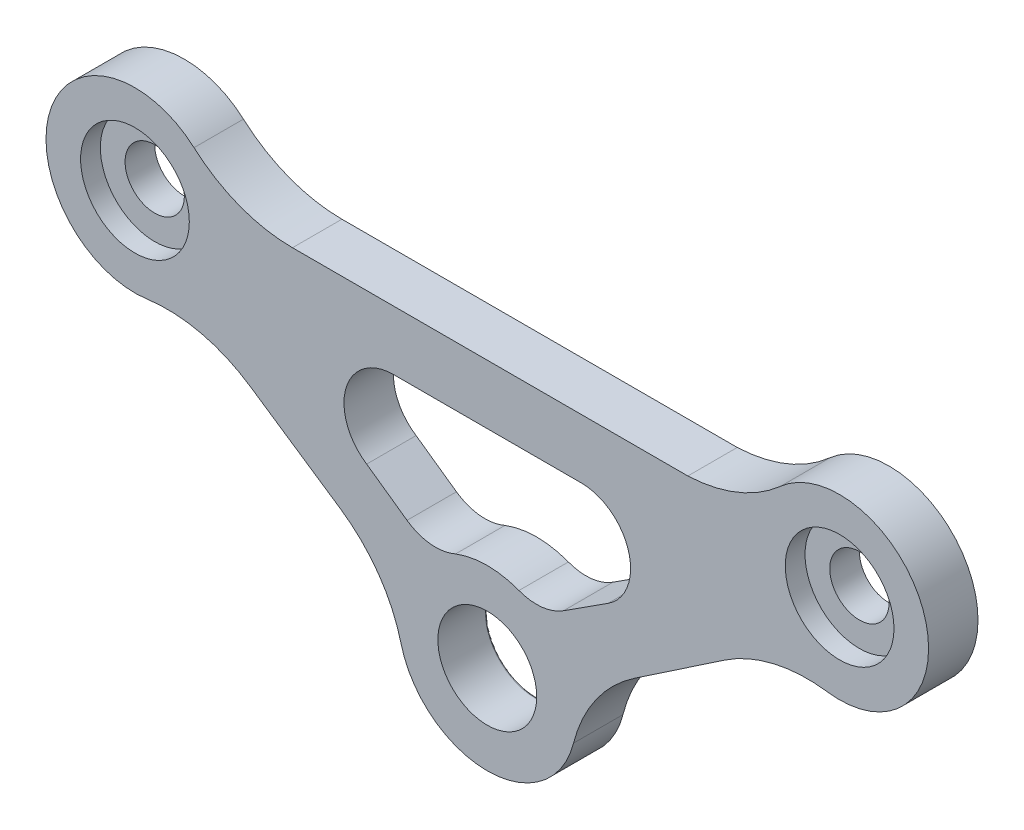
ISO-10303-21;
HEADER;
FILE_DESCRIPTION(('STEP AP214'),'2;1');
FILE_NAME('part.step','',(''),(''),'','','');
FILE_SCHEMA(('AUTOMOTIVE_DESIGN { 1 0 10303 214 1 1 1 1 }'));
ENDSEC;
DATA;
#1=APPLICATION_CONTEXT('core data for automotive mechanical design processes');
#2=APPLICATION_PROTOCOL_DEFINITION('international standard','automotive_design',2000,#1);
#3=PRODUCT_CONTEXT('',#1,'mechanical');
#4=PRODUCT('Part','Part','',(#3));
#5=PRODUCT_RELATED_PRODUCT_CATEGORY('part','',(#4));
#6=PRODUCT_DEFINITION_FORMATION('','',#4);
#7=PRODUCT_DEFINITION_CONTEXT('part definition',#1,'design');
#8=PRODUCT_DEFINITION('design','',#6,#7);
#9=PRODUCT_DEFINITION_SHAPE('','',#8);
#10=(LENGTH_UNIT() NAMED_UNIT(*) SI_UNIT(.MILLI.,.METRE.));
#11=(NAMED_UNIT(*) PLANE_ANGLE_UNIT() SI_UNIT($,.RADIAN.));
#12=(NAMED_UNIT(*) SI_UNIT($,.STERADIAN.) SOLID_ANGLE_UNIT());
#13=UNCERTAINTY_MEASURE_WITH_UNIT(LENGTH_MEASURE(1.E-05),#10,'distance_accuracy_value','');
#14=(GEOMETRIC_REPRESENTATION_CONTEXT(3) GLOBAL_UNCERTAINTY_ASSIGNED_CONTEXT((#13)) GLOBAL_UNIT_ASSIGNED_CONTEXT((#10,
#11,#12)) REPRESENTATION_CONTEXT('',''));
#15=CARTESIAN_POINT('',(0.,0.,0.));
#16=DIRECTION('',(0.,0.,1.));
#17=DIRECTION('',(1.,0.,0.));
#18=AXIS2_PLACEMENT_3D('',#15,#16,#17);
#19=CARTESIAN_POINT('',(35.64893240205,24.04550222281,1.5));
#20=DIRECTION('',(0.,0.,1.));
#21=DIRECTION('',(1.,0.,0.));
#22=AXIS2_PLACEMENT_3D('',#19,#20,#21);
#23=CYLINDRICAL_SURFACE('',#22,5.5);
#24=CARTESIAN_POINT('',(35.64893240205,24.04550222281,2.5));
#25=DIRECTION('',(0.,0.,1.));
#26=DIRECTION('',(1.,0.,0.));
#27=AXIS2_PLACEMENT_3D('',#24,#25,#26);
#28=CIRCLE('',#27,5.5);
#29=CARTESIAN_POINT('',(41.14893240205,24.04550222281,2.5));
#30=VERTEX_POINT('',#29);
#31=EDGE_CURVE('E229',#30,#30,#28,.F.);
#32=ORIENTED_EDGE('',*,*,#31,.F.);
#33=EDGE_LOOP('',(#32));
#34=FACE_BOUND('',#33,.T.);
#35=CARTESIAN_POINT('',(35.64893240205,24.04550222281,0.5));
#36=DIRECTION('',(0.,0.,1.));
#37=DIRECTION('',(1.,0.,0.));
#38=AXIS2_PLACEMENT_3D('',#35,#36,#37);
#39=CIRCLE('',#38,5.5);
#40=CARTESIAN_POINT('',(41.14893240205,24.04550222281,0.5));
#41=VERTEX_POINT('',#40);
#42=EDGE_CURVE('E241',#41,#41,#39,.T.);
#43=ORIENTED_EDGE('',*,*,#42,.F.);
#44=EDGE_LOOP('',(#43));
#45=FACE_BOUND('',#44,.T.);
#46=ADVANCED_FACE('F16',(#34,#45),#23,.F.);
#47=CARTESIAN_POINT('',(-35.64892089109,24.04550222281,1.5));
#48=DIRECTION('',(0.,0.,1.));
#49=DIRECTION('',(1.,0.,0.));
#50=AXIS2_PLACEMENT_3D('',#47,#48,#49);
#51=CYLINDRICAL_SURFACE('',#50,5.5);
#52=CARTESIAN_POINT('',(-35.64892089109,24.04550222281,2.5));
#53=DIRECTION('',(0.,0.,1.));
#54=DIRECTION('',(1.,0.,0.));
#55=AXIS2_PLACEMENT_3D('',#52,#53,#54);
#56=CIRCLE('',#55,5.5);
#57=CARTESIAN_POINT('',(-30.14892089109,24.04550222281,2.5));
#58=VERTEX_POINT('',#57);
#59=EDGE_CURVE('E169',#58,#58,#56,.F.);
#60=ORIENTED_EDGE('',*,*,#59,.F.);
#61=EDGE_LOOP('',(#60));
#62=FACE_BOUND('',#61,.T.);
#63=CARTESIAN_POINT('',(-35.64892089109,24.04550222281,0.5));
#64=DIRECTION('',(0.,0.,1.));
#65=DIRECTION('',(1.,0.,0.));
#66=AXIS2_PLACEMENT_3D('',#63,#64,#65);
#67=CIRCLE('',#66,5.5);
#68=CARTESIAN_POINT('',(-30.14892089109,24.04550222281,0.5));
#69=VERTEX_POINT('',#68);
#70=EDGE_CURVE('E237',#69,#69,#67,.T.);
#71=ORIENTED_EDGE('',*,*,#70,.F.);
#72=EDGE_LOOP('',(#71));
#73=FACE_BOUND('',#72,.T.);
#74=ADVANCED_FACE('F686',(#62,#73),#51,.F.);
#75=CARTESIAN_POINT('',(0.,0.,0.1));
#76=DIRECTION('',(0.,0.,1.));
#77=DIRECTION('',(1.,0.,0.));
#78=AXIS2_PLACEMENT_3D('',#75,#76,#77);
#79=CYLINDRICAL_SURFACE('',#78,5.);
#80=CARTESIAN_POINT('',(0.,0.,2.5));
#81=DIRECTION('',(0.,0.,1.));
#82=DIRECTION('',(1.,0.,0.));
#83=AXIS2_PLACEMENT_3D('',#80,#81,#82);
#84=CIRCLE('',#83,5.);
#85=CARTESIAN_POINT('',(5.,0.,2.5));
#86=VERTEX_POINT('',#85);
#87=EDGE_CURVE('E233',#86,#86,#84,.F.);
#88=ORIENTED_EDGE('',*,*,#87,.F.);
#89=EDGE_LOOP('',(#88));
#90=FACE_BOUND('',#89,.T.);
#91=CARTESIAN_POINT('',(0.,0.,-2.3));
#92=DIRECTION('',(0.,0.,1.));
#93=DIRECTION('',(0.,-1.,0.));
#94=AXIS2_PLACEMENT_3D('',#91,#92,#93);
#95=CIRCLE('',#94,5.);
#96=CARTESIAN_POINT('',(0.,-5.,-2.3));
#97=VERTEX_POINT('',#96);
#98=EDGE_CURVE('E189',#97,#97,#95,.T.);
#99=ORIENTED_EDGE('',*,*,#98,.F.);
#100=EDGE_LOOP('',(#99));
#101=FACE_BOUND('',#100,.T.);
#102=ADVANCED_FACE('F679',(#90,#101),#79,.F.);
#103=CARTESIAN_POINT('',(28.93034266074,17.3269124815,0.5));
#104=DIRECTION('',(0.,0.,1.));
#105=DIRECTION('',(1.,0.,0.));
#106=AXIS2_PLACEMENT_3D('',#103,#104,#105);
#107=PLANE('',#106);
#108=CARTESIAN_POINT('',(35.64893240205,24.04550222281,0.5));
#109=DIRECTION('',(0.,0.,1.));
#110=DIRECTION('',(1.,0.,0.));
#111=AXIS2_PLACEMENT_3D('',#108,#109,#110);
#112=CIRCLE('',#111,3.);
#113=CARTESIAN_POINT('',(38.64893240205,24.04550222281,0.5));
#114=VERTEX_POINT('',#113);
#115=EDGE_CURVE('E193',#114,#114,#112,.F.);
#116=ORIENTED_EDGE('',*,*,#115,.T.);
#117=EDGE_LOOP('',(#116));
#118=FACE_BOUND('',#117,.T.);
#119=ORIENTED_EDGE('',*,*,#42,.T.);
#120=EDGE_LOOP('',(#119));
#121=FACE_BOUND('',#120,.T.);
#122=ADVANCED_FACE('F515',(#118,#121),#107,.T.);
#123=CARTESIAN_POINT('',(-42.3675106324,17.3269124815,0.5));
#124=DIRECTION('',(0.,0.,1.));
#125=DIRECTION('',(1.,0.,0.));
#126=AXIS2_PLACEMENT_3D('',#123,#124,#125);
#127=PLANE('',#126);
#128=CARTESIAN_POINT('',(-35.64892089109,24.04550222281,0.5));
#129=DIRECTION('',(0.,0.,1.));
#130=DIRECTION('',(1.,0.,0.));
#131=AXIS2_PLACEMENT_3D('',#128,#129,#130);
#132=CIRCLE('',#131,3.);
#133=CARTESIAN_POINT('',(-32.64892089109,24.04550222281,0.5));
#134=VERTEX_POINT('',#133);
#135=EDGE_CURVE('E409',#134,#134,#132,.F.);
#136=ORIENTED_EDGE('',*,*,#135,.T.);
#137=EDGE_LOOP('',(#136));
#138=FACE_BOUND('',#137,.T.);
#139=ORIENTED_EDGE('',*,*,#70,.T.);
#140=EDGE_LOOP('',(#139));
#141=FACE_BOUND('',#140,.T.);
#142=ADVANCED_FACE('F666',(#138,#141),#127,.T.);
#143=CARTESIAN_POINT('',(-53.80166707867,-13.48273707526,2.5));
#144=DIRECTION('',(0.,0.,1.));
#145=DIRECTION('',(1.,0.,0.));
#146=AXIS2_PLACEMENT_3D('',#143,#144,#145);
#147=PLANE('',#146);
#148=CARTESIAN_POINT('',(-5.235668754389,12.9790059498,2.5));
#149=DIRECTION('',(0.,0.,-1.));
#150=DIRECTION('',(-1.,0.,0.));
#151=AXIS2_PLACEMENT_3D('',#148,#149,#150);
#152=CIRCLE('',#151,4.999999999993);
#153=CARTESIAN_POINT('',(-3.20413659858878,8.41032155493498,2.5));
#154=VERTEX_POINT('',#153);
#155=CARTESIAN_POINT('',(-8.12159551358728,8.89594009918456,2.5));
#156=VERTEX_POINT('',#155);
#157=EDGE_CURVE('E326',#154,#156,#152,.T.);
#158=ORIENTED_EDGE('',*,*,#157,.T.);
#159=DIRECTION('',(-0.816613006149319,0.577185583835713,0.));
#160=VECTOR('',#159,1.);
#161=CARTESIAN_POINT('',(-7.578312031756,8.511944998338,2.5));
#162=LINE('',#161,#160);
#163=CARTESIAN_POINT('',(-12.2046620185913,11.7818690403664,2.5));
#164=VERTEX_POINT('',#163);
#165=EDGE_CURVE('E405',#164,#156,#162,.F.);
#166=ORIENTED_EDGE('',*,*,#165,.F.);
#167=CARTESIAN_POINT('',(-9.499997749285,15.98719794432,2.5));
#168=DIRECTION('',(0.,0.,-1.));
#169=DIRECTION('',(-1.,0.,0.));
#170=AXIS2_PLACEMENT_3D('',#167,#168,#169);
#171=CIRCLE('',#170,5.000000000009);
#172=CARTESIAN_POINT('',(-9.49999775994559,20.9871979443295,2.5));
#173=VERTEX_POINT('',#172);
#174=EDGE_CURVE('E493',#164,#173,#171,.T.);
#175=ORIENTED_EDGE('',*,*,#174,.T.);
#176=DIRECTION('',(1.,0.,0.));
#177=VECTOR('',#176,1.);
#178=CARTESIAN_POINT('',(-11.5185874906,20.98719794433,2.5));
#179=LINE('',#178,#177);
#180=CARTESIAN_POINT('',(9.50000225785928,20.98719794433,2.5));
#181=VERTEX_POINT('',#180);
#182=EDGE_CURVE('E410',#181,#173,#179,.F.);
#183=ORIENTED_EDGE('',*,*,#182,.F.);
#184=CARTESIAN_POINT('',(9.500002250715,15.98719794429,2.5));
#185=DIRECTION('',(0.,0.,-1.));
#186=DIRECTION('',(-1.,0.,0.));
#187=AXIS2_PLACEMENT_3D('',#184,#185,#186);
#188=CIRCLE('',#187,5.000000000039);
#189=CARTESIAN_POINT('',(12.2046662838837,11.7818688884277,2.5));
#190=VERTEX_POINT('',#189);
#191=EDGE_CURVE('E418',#181,#190,#188,.T.);
#192=ORIENTED_EDGE('',*,*,#191,.T.);
#193=DIRECTION('',(-0.84106582120401,-0.540932791021606,0.));
#194=VECTOR('',#193,1.);
#195=CARTESIAN_POINT('',(12.79122582465,12.15911556935,2.5));
#196=LINE('',#195,#194);
#197=CARTESIAN_POINT('',(7.71750000606634,8.89594091793455,2.5));
#198=VERTEX_POINT('',#197);
#199=EDGE_CURVE('E414',#198,#190,#196,.F.);
#200=ORIENTED_EDGE('',*,*,#199,.F.);
#201=CARTESIAN_POINT('',(4.984212486652,13.0827224188,2.5));
#202=DIRECTION('',(0.,0.,-1.));
#203=DIRECTION('',(-1.,0.,0.));
#204=AXIS2_PLACEMENT_3D('',#201,#202,#203);
#205=CIRCLE('',#204,4.999999999995);
#206=CARTESIAN_POINT('',(3.20414677618147,8.41031767750996,2.5));
#207=VERTEX_POINT('',#206);
#208=EDGE_CURVE('E311',#198,#207,#205,.T.);
#209=ORIENTED_EDGE('',*,*,#208,.T.);
#210=CARTESIAN_POINT('',(0.,0.,2.5));
#211=DIRECTION('',(0.,0.,-1.));
#212=DIRECTION('',(-1.,0.,0.));
#213=AXIS2_PLACEMENT_3D('',#210,#211,#212);
#214=CIRCLE('',#213,8.99999999999);
#215=EDGE_CURVE('E322',#154,#207,#214,.T.);
#216=ORIENTED_EDGE('',*,*,#215,.F.);
#217=EDGE_LOOP('',(#158,#166,#175,#183,#192,#200,#209,#216));
#218=FACE_BOUND('',#217,.T.);
#219=ORIENTED_EDGE('',*,*,#59,.T.);
#220=EDGE_LOOP('',(#219));
#221=FACE_BOUND('',#220,.T.);
#222=ORIENTED_EDGE('',*,*,#31,.T.);
#223=EDGE_LOOP('',(#222));
#224=FACE_BOUND('',#223,.T.);
#225=ORIENTED_EDGE('',*,*,#87,.T.);
#226=EDGE_LOOP('',(#225));
#227=FACE_BOUND('',#226,.T.);
#228=CARTESIAN_POINT('',(-19.70854590692,41.98719794437,2.5));
#229=DIRECTION('',(0.,0.,-1.));
#230=DIRECTION('',(-1.,0.,0.));
#231=AXIS2_PLACEMENT_3D('',#228,#229,#230);
#232=CIRCLE('',#231,15.00000000001);
#233=CARTESIAN_POINT('',(-19.7085486342382,26.98719794436,2.5));
#234=VERTEX_POINT('',#233);
#235=CARTESIAN_POINT('',(-29.6712824229047,30.7736400293567,2.5));
#236=VERTEX_POINT('',#235);
#237=EDGE_CURVE('E165',#234,#236,#232,.T.);
#238=ORIENTED_EDGE('',*,*,#237,.T.);
#239=CARTESIAN_POINT('',(-35.64892089109,24.04550222281,2.5));
#240=DIRECTION('',(0.,0.,-1.));
#241=DIRECTION('',(-1.,0.,0.));
#242=AXIS2_PLACEMENT_3D('',#239,#240,#241);
#243=CIRCLE('',#242,9.000000000014);
#244=CARTESIAN_POINT('',(-34.4257834115742,15.1290043280954,2.5));
#245=VERTEX_POINT('',#244);
#246=EDGE_CURVE('E157',#245,#236,#243,.T.);
#247=ORIENTED_EDGE('',*,*,#246,.F.);
#248=CARTESIAN_POINT('',(-32.3872209457,0.2681745036064,2.5));
#249=DIRECTION('',(0.,0.,-1.));
#250=DIRECTION('',(-1.,0.,0.));
#251=AXIS2_PLACEMENT_3D('',#248,#249,#250);
#252=CIRCLE('',#251,14.99999999999);
#253=CARTESIAN_POINT('',(-23.9993316949897,12.7037409932183,2.5));
#254=VERTEX_POINT('',#253);
#255=EDGE_CURVE('E162',#245,#254,#252,.T.);
#256=ORIENTED_EDGE('',*,*,#255,.T.);
#257=DIRECTION('',(0.829037598608781,-0.559192864844487,0.));
#258=VECTOR('',#257,1.);
#259=CARTESIAN_POINT('',(-13.83149060533,5.845446269613,2.5));
#260=LINE('',#259,#258);
#261=CARTESIAN_POINT('',(-14.879917539189,6.55261909471597,2.5));
#262=VERTEX_POINT('',#261);
#263=EDGE_CURVE('E180',#262,#254,#260,.F.);
#264=ORIENTED_EDGE('',*,*,#263,.F.);
#265=CARTESIAN_POINT('',(-23.26780930641,-5.882945697494,2.5));
#266=DIRECTION('',(0.,0.,-1.));
#267=DIRECTION('',(-1.,0.,0.));
#268=AXIS2_PLACEMENT_3D('',#265,#266,#267);
#269=CIRCLE('',#268,14.99999999999);
#270=CARTESIAN_POINT('',(-8.72542895208777,-2.20610280855798,2.5));
#271=VERTEX_POINT('',#270);
#272=EDGE_CURVE('E195',#262,#271,#269,.T.);
#273=ORIENTED_EDGE('',*,*,#272,.T.);
#274=CARTESIAN_POINT('',(0.,0.,2.5));
#275=DIRECTION('',(0.,0.,-1.));
#276=DIRECTION('',(-1.,0.,0.));
#277=AXIS2_PLACEMENT_3D('',#274,#275,#276);
#278=CIRCLE('',#277,8.99999999999);
#279=CARTESIAN_POINT('',(8.7254284899058,-2.20610463654231,2.5));
#280=VERTEX_POINT('',#279);
#281=EDGE_CURVE('E199',#280,#271,#278,.T.);
#282=ORIENTED_EDGE('',*,*,#281,.F.);
#283=CARTESIAN_POINT('',(23.26780930641,-5.882945697493,2.5));
#284=DIRECTION('',(0.,0.,-1.));
#285=DIRECTION('',(-1.,0.,0.));
#286=AXIS2_PLACEMENT_3D('',#283,#284,#285);
#287=CIRCLE('',#286,14.99999999999);
#288=CARTESIAN_POINT('',(14.8799187446377,6.55261990779489,2.5));
#289=VERTEX_POINT('',#288);
#290=EDGE_CURVE('E204',#280,#289,#287,.T.);
#291=ORIENTED_EDGE('',*,*,#290,.T.);
#292=DIRECTION('',(0.829037598608781,0.559192864844487,0.));
#293=VECTOR('',#292,1.);
#294=CARTESIAN_POINT('',(25.04775564686,13.41091180694,2.5));
#295=LINE('',#294,#293);
#296=CARTESIAN_POINT('',(23.9993299184323,12.7037397949107,2.5));
#297=VERTEX_POINT('',#296);
#298=EDGE_CURVE('E208',#297,#289,#295,.F.);
#299=ORIENTED_EDGE('',*,*,#298,.F.);
#300=CARTESIAN_POINT('',(32.38722289111,0.2681758157956,2.5));
#301=DIRECTION('',(0.,0.,-1.));
#302=DIRECTION('',(-1.,0.,0.));
#303=AXIS2_PLACEMENT_3D('',#300,#301,#302);
#304=CIRCLE('',#303,14.99999999999);
#305=CARTESIAN_POINT('',(34.4257471339366,15.1290108836449,2.5));
#306=VERTEX_POINT('',#305);
#307=EDGE_CURVE('E209',#297,#306,#304,.T.);
#308=ORIENTED_EDGE('',*,*,#307,.T.);
#309=CARTESIAN_POINT('',(35.64893240205,24.04550222281,2.5));
#310=DIRECTION('',(0.,0.,-1.));
#311=DIRECTION('',(-1.,0.,0.));
#312=AXIS2_PLACEMENT_3D('',#309,#310,#311);
#313=CIRCLE('',#312,8.999999999995);
#314=CARTESIAN_POINT('',(29.6663114142714,30.7692099883951,2.5));
#315=VERTEX_POINT('',#314);
#316=EDGE_CURVE('E213',#315,#306,#313,.T.);
#317=ORIENTED_EDGE('',*,*,#316,.F.);
#318=CARTESIAN_POINT('',(19.69522475353,41.97534361275,2.5));
#319=DIRECTION('',(0.,0.,-1.));
#320=DIRECTION('',(-1.,0.,0.));
#321=AXIS2_PLACEMENT_3D('',#318,#319,#320);
#322=CIRCLE('',#321,15.00000000007);
#323=CARTESIAN_POINT('',(20.2914901578057,26.9871986617122,2.5));
#324=VERTEX_POINT('',#323);
#325=EDGE_CURVE('E218',#315,#324,#322,.T.);
#326=ORIENTED_EDGE('',*,*,#325,.T.);
#327=DIRECTION('',(1.,0.,0.));
#328=VECTOR('',#327,1.);
#329=CARTESIAN_POINT('',(-23.82713564823,26.98719794436,2.5));
#330=LINE('',#329,#328);
#331=EDGE_CURVE('E222',#234,#324,#330,.T.);
#332=ORIENTED_EDGE('',*,*,#331,.F.);
#333=EDGE_LOOP('',(#238,#247,#256,#264,#273,#282,#291,#299,#308,#317,#326,#332));
#334=FACE_BOUND('',#333,.T.);
#335=ADVANCED_FACE('F159',(#218,#221,#224,#227,#334),#147,.T.);
#336=CARTESIAN_POINT('',(-35.64892089109,24.04550222281,0.));
#337=DIRECTION('',(0.,0.,-1.));
#338=DIRECTION('',(-1.,0.,0.));
#339=AXIS2_PLACEMENT_3D('',#336,#337,#338);
#340=CYLINDRICAL_SURFACE('',#339,9.000000000014);
#341=CARTESIAN_POINT('',(-35.64892089109,24.04550222281,-2.5));
#342=DIRECTION('',(0.,0.,-1.));
#343=DIRECTION('',(-1.,0.,0.));
#344=AXIS2_PLACEMENT_3D('',#341,#342,#343);
#345=CIRCLE('',#344,9.000000000014);
#346=CARTESIAN_POINT('',(-34.4257834115742,15.1290043280954,-2.5));
#347=VERTEX_POINT('',#346);
#348=CARTESIAN_POINT('',(-29.6712824229047,30.7736400293567,-2.5));
#349=VERTEX_POINT('',#348);
#350=EDGE_CURVE('E175',#347,#349,#345,.T.);
#351=ORIENTED_EDGE('',*,*,#350,.F.);
#352=DIRECTION('',(0.,0.,-1.));
#353=VECTOR('',#352,1.);
#354=CARTESIAN_POINT('',(-34.4257834115813,15.1290043280947,0.));
#355=LINE('',#354,#353);
#356=EDGE_CURVE('E172',#347,#245,#355,.F.);
#357=ORIENTED_EDGE('',*,*,#356,.T.);
#358=ORIENTED_EDGE('',*,*,#246,.T.);
#359=DIRECTION('',(0.,0.,-1.));
#360=VECTOR('',#359,1.);
#361=CARTESIAN_POINT('',(-29.6712845737851,30.7736419403162,0.));
#362=LINE('',#361,#360);
#363=EDGE_CURVE('E224',#236,#349,#362,.T.);
#364=ORIENTED_EDGE('',*,*,#363,.T.);
#365=EDGE_LOOP('',(#351,#357,#358,#364));
#366=FACE_BOUND('',#365,.T.);
#367=ADVANCED_FACE('F173',(#366),#340,.T.);
#368=CARTESIAN_POINT('',(-19.70854590692,41.98719794437,0.));
#369=DIRECTION('',(0.,0.,-1.));
#370=DIRECTION('',(-1.,0.,0.));
#371=AXIS2_PLACEMENT_3D('',#368,#369,#370);
#372=CYLINDRICAL_SURFACE('',#371,15.00000000001);
#373=ORIENTED_EDGE('',*,*,#237,.F.);
#374=DIRECTION('',(0.,0.,1.));
#375=VECTOR('',#374,1.);
#376=CARTESIAN_POINT('',(-19.7085513615564,26.98719794436,-3.118589741315));
#377=LINE('',#376,#375);
#378=CARTESIAN_POINT('',(-19.7085486342382,26.9871979443605,-2.5));
#379=VERTEX_POINT('',#378);
#380=EDGE_CURVE('E394',#379,#234,#377,.T.);
#381=ORIENTED_EDGE('',*,*,#380,.F.);
#382=CARTESIAN_POINT('',(-19.70854590692,41.98719794437,-2.5));
#383=DIRECTION('',(0.,0.,-1.));
#384=DIRECTION('',(-1.,0.,0.));
#385=AXIS2_PLACEMENT_3D('',#382,#383,#384);
#386=CIRCLE('',#385,15.00000000001);
#387=EDGE_CURVE('E487',#349,#379,#386,.F.);
#388=ORIENTED_EDGE('',*,*,#387,.F.);
#389=ORIENTED_EDGE('',*,*,#363,.F.);
#390=EDGE_LOOP('',(#373,#381,#388,#389));
#391=FACE_BOUND('',#390,.T.);
#392=ADVANCED_FACE('F648',(#391),#372,.F.);
#393=CARTESIAN_POINT('',(-23.82713564823,26.98719794436,-3.118589741315));
#394=DIRECTION('',(0.,1.,0.));
#395=DIRECTION('',(0.,0.,1.));
#396=AXIS2_PLACEMENT_3D('',#393,#394,#395);
#397=PLANE('',#396);
#398=CARTESIAN_POINT('',(20.2914901578057,26.9871993790644,2.5));
#399=CARTESIAN_POINT('',(20.2914896316677,26.9871993581333,2.29166666666667));
#400=CARTESIAN_POINT('',(20.2914891055298,26.9871993372023,2.08333333333333));
#401=CARTESIAN_POINT('',(20.2914880532539,26.9871992953402,1.66666666666667));
#402=CARTESIAN_POINT('',(20.291487527116,26.9871992744093,1.45833333333333));
#403=CARTESIAN_POINT('',(20.2914864748401,26.9871992325473,1.04166666666667));
#404=CARTESIAN_POINT('',(20.2914859487021,26.9871992116164,0.833333333333333));
#405=CARTESIAN_POINT('',(20.2914848964262,26.9871991697546,0.416666666666667));
#406=CARTESIAN_POINT('',(20.2914843702882,26.9871991488237,0.208333333333333));
#407=CARTESIAN_POINT('',(20.2914833180123,26.987199106962,-0.208333333333333));
#408=CARTESIAN_POINT('',(20.2914827918744,26.9871990860312,-0.416666666666667));
#409=CARTESIAN_POINT('',(20.2914817395985,26.9871990441696,-0.833333333333333));
#410=CARTESIAN_POINT('',(20.2914812134605,26.9871990232389,-1.04166666666667));
#411=CARTESIAN_POINT('',(20.2914801611846,26.9871989813774,-1.45833333333333));
#412=CARTESIAN_POINT('',(20.2914796350466,26.9871989604467,-1.66666666666667));
#413=CARTESIAN_POINT('',(20.2914785827707,26.9871989185853,-2.08333333333333));
#414=CARTESIAN_POINT('',(20.2914780566327,26.9871988976547,-2.29166666666667));
#415=CARTESIAN_POINT('',(20.2914775304947,26.9871988767241,-2.5));
#416=B_SPLINE_CURVE_WITH_KNOTS('',3,(#398,#399,#400,#401,#402,#403,#404,#405,#406,#407,#408,
#409,#410,#411,#412,#413,#414,#415),.UNSPECIFIED.,.F.,.F.,(4,2,2,2,2,2,2,2,4),(0.,
0.625000000001996,1.25000000000399,1.87500000000599,2.50000000000799,3.12500000000998,
3.75000000001198,4.37500000001397,5.00000000001597),.UNSPECIFIED.);
#417=CARTESIAN_POINT('',(20.2914775304947,26.9871988767241,-2.5));
#418=VERTEX_POINT('',#417);
#419=EDGE_CURVE('E221',#324,#418,#416,.T.);
#420=ORIENTED_EDGE('',*,*,#419,.T.);
#421=DIRECTION('',(-1.,0.,0.));
#422=VECTOR('',#421,1.);
#423=CARTESIAN_POINT('',(-53.80166707867,26.987197944361,-2.5));
#424=LINE('',#423,#422);
#425=EDGE_CURVE('E486',#379,#418,#424,.F.);
#426=ORIENTED_EDGE('',*,*,#425,.F.);
#427=ORIENTED_EDGE('',*,*,#380,.T.);
#428=ORIENTED_EDGE('',*,*,#331,.T.);
#429=EDGE_LOOP('',(#420,#426,#427,#428));
#430=FACE_BOUND('',#429,.T.);
#431=ADVANCED_FACE('F388',(#430),#397,.T.);
#432=CARTESIAN_POINT('',(19.69522475353,41.97534361275,0.));
#433=DIRECTION('',(0.,0.,-1.));
#434=DIRECTION('',(-1.,0.,0.));
#435=AXIS2_PLACEMENT_3D('',#432,#433,#434);
#436=CYLINDRICAL_SURFACE('',#435,15.00000000007);
#437=ORIENTED_EDGE('',*,*,#325,.F.);
#438=CARTESIAN_POINT('',(29.6662920339491,30.7691927440847,-2.5));
#439=CARTESIAN_POINT('',(29.6662928414622,30.769193462598,-2.29166666666667));
#440=CARTESIAN_POINT('',(29.6662936489755,30.7691941811111,-2.08333333333333));
#441=CARTESIAN_POINT('',(29.6662952640023,30.769195618137,-1.66666666666667));
#442=CARTESIAN_POINT('',(29.6662960715158,30.7691963366498,-1.45833333333333));
#443=CARTESIAN_POINT('',(29.6662976865432,30.7691977736751,-1.04166666666667));
#444=CARTESIAN_POINT('',(29.6662984940569,30.7691984921877,-0.833333333333333));
#445=CARTESIAN_POINT('',(29.6663001090848,30.7691999292124,-0.416666666666667));
#446=CARTESIAN_POINT('',(29.6663009165988,30.7692006477246,-0.208333333333333));
#447=CARTESIAN_POINT('',(29.6663025316272,30.7692020847488,0.208333333333333));
#448=CARTESIAN_POINT('',(29.6663033391415,30.7692028032608,0.416666666666667));
#449=CARTESIAN_POINT('',(29.6663049541704,30.7692042402844,0.833333333333333));
#450=CARTESIAN_POINT('',(29.666305761685,30.769204958796,1.04166666666667));
#451=CARTESIAN_POINT('',(29.6663073767144,30.769206395819,1.45833333333333));
#452=CARTESIAN_POINT('',(29.6663081842292,30.7692071143304,1.66666666666667));
#453=CARTESIAN_POINT('',(29.6663097992591,30.7692085513528,2.08333333333333));
#454=CARTESIAN_POINT('',(29.6663106067742,30.7692092698639,2.29166666666667));
#455=CARTESIAN_POINT('',(29.6663114142894,30.7692099883748,2.5));
#456=B_SPLINE_CURVE_WITH_KNOTS('',3,(#438,#439,#440,#441,#442,#443,#444,#445,#446,#447,#448,
#449,#450,#451,#452,#453,#454,#455),.UNSPECIFIED.,.F.,.F.,(4,2,2,2,2,2,2,2,4),(0.,
0.625000000008412,1.25000000001682,1.87500000002524,2.50000000003365,3.12500000004206,
3.75000000005047,4.37500000005888,5.0000000000673),.UNSPECIFIED.);
#457=CARTESIAN_POINT('',(29.6662920339111,30.7691927440509,-2.5));
#458=VERTEX_POINT('',#457);
#459=EDGE_CURVE('E217',#458,#315,#456,.T.);
#460=ORIENTED_EDGE('',*,*,#459,.F.);
#461=CARTESIAN_POINT('',(19.69522475353,41.97534361275,-2.5));
#462=DIRECTION('',(0.,0.,-1.));
#463=DIRECTION('',(-1.,0.,0.));
#464=AXIS2_PLACEMENT_3D('',#461,#462,#463);
#465=CIRCLE('',#464,15.00000000007);
#466=EDGE_CURVE('E482',#418,#458,#465,.F.);
#467=ORIENTED_EDGE('',*,*,#466,.F.);
#468=ORIENTED_EDGE('',*,*,#419,.F.);
#469=EDGE_LOOP('',(#437,#460,#467,#468));
#470=FACE_BOUND('',#469,.T.);
#471=ADVANCED_FACE('F383',(#470),#436,.F.);
#472=CARTESIAN_POINT('',(35.64893240205,24.04550222281,0.));
#473=DIRECTION('',(0.,0.,-1.));
#474=DIRECTION('',(-1.,0.,0.));
#475=AXIS2_PLACEMENT_3D('',#472,#473,#474);
#476=CYLINDRICAL_SURFACE('',#475,8.999999999995);
#477=ORIENTED_EDGE('',*,*,#316,.T.);
#478=CARTESIAN_POINT('',(34.4257471339243,15.1290108835554,2.5));
#479=CARTESIAN_POINT('',(34.42574977951,15.1290105206491,2.29166666666667));
#480=CARTESIAN_POINT('',(34.4257524250957,15.1290101577421,2.08333333333333));
#481=CARTESIAN_POINT('',(34.4257577162667,15.1290094319266,1.66666666666667));
#482=CARTESIAN_POINT('',(34.4257603618522,15.1290090690182,1.45833333333333));
#483=CARTESIAN_POINT('',(34.4257656530229,15.1290083432,1.04166666666667));
#484=CARTESIAN_POINT('',(34.4257682986081,15.1290079802901,0.833333333333333));
#485=CARTESIAN_POINT('',(34.4257735897784,15.1290072544691,0.416666666666667));
#486=CARTESIAN_POINT('',(34.4257762353635,15.1290068915578,0.208333333333333));
#487=CARTESIAN_POINT('',(34.4257815265334,15.1290061657339,-0.208333333333333));
#488=CARTESIAN_POINT('',(34.4257841721182,15.1290058028213,-0.416666666666667));
#489=CARTESIAN_POINT('',(34.4257894632877,15.1290050769945,-0.833333333333333));
#490=CARTESIAN_POINT('',(34.4257921088724,15.1290047140805,-1.04166666666667));
#491=CARTESIAN_POINT('',(34.4257974000415,15.1290039882509,-1.45833333333333));
#492=CARTESIAN_POINT('',(34.425800045626,15.1290036253354,-1.66666666666667));
#493=CARTESIAN_POINT('',(34.4258053367947,15.1290028995031,-2.08333333333333));
#494=CARTESIAN_POINT('',(34.425807982379,15.1290025365862,-2.29166666666667));
#495=CARTESIAN_POINT('',(34.4258106279632,15.1290021736686,-2.5));
#496=B_SPLINE_CURVE_WITH_KNOTS('',3,(#478,#479,#480,#481,#482,#483,#484,#485,#486,#487,#488,
#489,#490,#491,#492,#493,#494,#495),.UNSPECIFIED.,.F.,.F.,(4,2,2,2,2,2,2,2,4),(0.,
0.625000000051342,1.25000000010268,1.87500000015403,2.50000000020537,3.12500000025671,
3.75000000030805,4.37500000035939,5.00000000041073),.UNSPECIFIED.);
#497=CARTESIAN_POINT('',(34.4258106279632,15.1290021736686,-2.5));
#498=VERTEX_POINT('',#497);
#499=EDGE_CURVE('E212',#306,#498,#496,.T.);
#500=ORIENTED_EDGE('',*,*,#499,.T.);
#501=CARTESIAN_POINT('',(35.64893240205,24.04550222281,-2.5));
#502=DIRECTION('',(0.,0.,-1.));
#503=DIRECTION('',(-1.,0.,0.));
#504=AXIS2_PLACEMENT_3D('',#501,#502,#503);
#505=CIRCLE('',#504,8.999999999995);
#506=EDGE_CURVE('E478',#458,#498,#505,.T.);
#507=ORIENTED_EDGE('',*,*,#506,.F.);
#508=ORIENTED_EDGE('',*,*,#459,.T.);
#509=EDGE_LOOP('',(#477,#500,#507,#508));
#510=FACE_BOUND('',#509,.T.);
#511=ADVANCED_FACE('F377',(#510),#476,.T.);
#512=CARTESIAN_POINT('',(32.38722289111,0.2681758157956,0.));
#513=DIRECTION('',(0.,0.,-1.));
#514=DIRECTION('',(-1.,0.,0.));
#515=AXIS2_PLACEMENT_3D('',#512,#513,#514);
#516=CYLINDRICAL_SURFACE('',#515,14.99999999999);
#517=ORIENTED_EDGE('',*,*,#307,.F.);
#518=DIRECTION('',(0.,0.,1.));
#519=VECTOR('',#518,1.);
#520=CARTESIAN_POINT('',(23.9993299184175,12.7037397949007,-3.118589741315));
#521=LINE('',#520,#519);
#522=CARTESIAN_POINT('',(23.999329918434,12.7037397949106,-2.5));
#523=VERTEX_POINT('',#522);
#524=EDGE_CURVE('E356',#523,#297,#521,.T.);
#525=ORIENTED_EDGE('',*,*,#524,.F.);
#526=CARTESIAN_POINT('',(32.38722289111,0.2681758157956,-2.5));
#527=DIRECTION('',(0.,0.,-1.));
#528=DIRECTION('',(-1.,0.,0.));
#529=AXIS2_PLACEMENT_3D('',#526,#527,#528);
#530=CIRCLE('',#529,14.99999999999);
#531=EDGE_CURVE('E474',#498,#523,#530,.F.);
#532=ORIENTED_EDGE('',*,*,#531,.F.);
#533=ORIENTED_EDGE('',*,*,#499,.F.);
#534=EDGE_LOOP('',(#517,#525,#532,#533));
#535=FACE_BOUND('',#534,.T.);
#536=ADVANCED_FACE('F367',(#535),#516,.F.);
#537=CARTESIAN_POINT('',(25.04775564686,13.41091180694,-3.118589741315));
#538=DIRECTION('',(0.559192864844487,-0.829037598608781,0.));
#539=DIRECTION('',(0.829037598608781,0.559192864844487,0.));
#540=AXIS2_PLACEMENT_3D('',#537,#538,#539);
#541=PLANE('',#540);
#542=DIRECTION('',(0.,0.,-1.));
#543=VECTOR('',#542,1.);
#544=CARTESIAN_POINT('',(14.879921155527,6.55262153395956,0.));
#545=LINE('',#544,#543);
#546=CARTESIAN_POINT('',(14.8799187446388,6.55261990779566,-2.5));
#547=VERTEX_POINT('',#546);
#548=EDGE_CURVE('E207',#289,#547,#545,.T.);
#549=ORIENTED_EDGE('',*,*,#548,.T.);
#550=DIRECTION('',(-0.829037598608884,-0.559192864844336,0.));
#551=VECTOR('',#550,1.);
#552=CARTESIAN_POINT('',(23.9993299184186,12.703739794899,-2.5));
#553=LINE('',#552,#551);
#554=EDGE_CURVE('E473',#523,#547,#553,.T.);
#555=ORIENTED_EDGE('',*,*,#554,.F.);
#556=ORIENTED_EDGE('',*,*,#524,.T.);
#557=ORIENTED_EDGE('',*,*,#298,.T.);
#558=EDGE_LOOP('',(#549,#555,#556,#557));
#559=FACE_BOUND('',#558,.T.);
#560=ADVANCED_FACE('F376',(#559),#541,.T.);
#561=CARTESIAN_POINT('',(23.26780930641,-5.882945697493,0.));
#562=DIRECTION('',(0.,0.,-1.));
#563=DIRECTION('',(-1.,0.,0.));
#564=AXIS2_PLACEMENT_3D('',#561,#562,#563);
#565=CYLINDRICAL_SURFACE('',#564,14.99999999999);
#566=ORIENTED_EDGE('',*,*,#290,.F.);
#567=DIRECTION('',(0.,0.,-1.));
#568=VECTOR('',#567,1.);
#569=CARTESIAN_POINT('',(8.72542848990938,-2.20610463652513,0.));
#570=LINE('',#569,#568);
#571=CARTESIAN_POINT('',(8.72542848990509,-2.20610463654213,-2.5));
#572=VERTEX_POINT('',#571);
#573=EDGE_CURVE('E203',#572,#280,#570,.F.);
#574=ORIENTED_EDGE('',*,*,#573,.F.);
#575=CARTESIAN_POINT('',(23.26780930641,-5.882945697493,-2.5));
#576=DIRECTION('',(0.,0.,-1.));
#577=DIRECTION('',(-1.,0.,0.));
#578=AXIS2_PLACEMENT_3D('',#575,#576,#577);
#579=CIRCLE('',#578,14.99999999999);
#580=EDGE_CURVE('E469',#547,#572,#579,.F.);
#581=ORIENTED_EDGE('',*,*,#580,.F.);
#582=ORIENTED_EDGE('',*,*,#548,.F.);
#583=EDGE_LOOP('',(#566,#574,#581,#582));
#584=FACE_BOUND('',#583,.T.);
#585=ADVANCED_FACE('F602',(#584),#565,.F.);
#586=CARTESIAN_POINT('',(0.,0.,0.));
#587=DIRECTION('',(0.,0.,-1.));
#588=DIRECTION('',(-1.,0.,0.));
#589=AXIS2_PLACEMENT_3D('',#586,#587,#588);
#590=CYLINDRICAL_SURFACE('',#589,8.99999999999);
#591=ORIENTED_EDGE('',*,*,#281,.T.);
#592=DIRECTION('',(0.,0.,-1.));
#593=VECTOR('',#592,1.);
#594=CARTESIAN_POINT('',(-8.72542941427317,-2.20610098055606,0.));
#595=LINE('',#594,#593);
#596=CARTESIAN_POINT('',(-8.72542895208777,-2.20610280855798,-2.5));
#597=VERTEX_POINT('',#596);
#598=EDGE_CURVE('E198',#271,#597,#595,.T.);
#599=ORIENTED_EDGE('',*,*,#598,.T.);
#600=CARTESIAN_POINT('',(0.,0.,-2.5));
#601=DIRECTION('',(0.,0.,-1.));
#602=DIRECTION('',(-1.,0.,0.));
#603=AXIS2_PLACEMENT_3D('',#600,#601,#602);
#604=CIRCLE('',#603,8.99999999999);
#605=EDGE_CURVE('E465',#572,#597,#604,.T.);
#606=ORIENTED_EDGE('',*,*,#605,.F.);
#607=ORIENTED_EDGE('',*,*,#573,.T.);
#608=EDGE_LOOP('',(#591,#599,#606,#607));
#609=FACE_BOUND('',#608,.T.);
#610=ADVANCED_FACE('F606',(#609),#590,.T.);
#611=CARTESIAN_POINT('',(-23.26780930641,-5.882945697494,0.));
#612=DIRECTION('',(0.,0.,-1.));
#613=DIRECTION('',(-1.,0.,0.));
#614=AXIS2_PLACEMENT_3D('',#611,#612,#613);
#615=CYLINDRICAL_SURFACE('',#614,14.99999999999);
#616=ORIENTED_EDGE('',*,*,#272,.F.);
#617=DIRECTION('',(0.,0.,1.));
#618=VECTOR('',#617,1.);
#619=CARTESIAN_POINT('',(-14.8799187446328,6.55261990779798,-3.118589741315));
#620=LINE('',#619,#618);
#621=CARTESIAN_POINT('',(-14.8799175391901,6.55261909471674,-2.5));
#622=VERTEX_POINT('',#621);
#623=EDGE_CURVE('E345',#622,#262,#620,.T.);
#624=ORIENTED_EDGE('',*,*,#623,.F.);
#625=CARTESIAN_POINT('',(-23.26780930641,-5.882945697494,-2.5));
#626=DIRECTION('',(0.,0.,-1.));
#627=DIRECTION('',(-1.,0.,0.));
#628=AXIS2_PLACEMENT_3D('',#625,#626,#627);
#629=CIRCLE('',#628,14.99999999999);
#630=EDGE_CURVE('E461',#597,#622,#629,.F.);
#631=ORIENTED_EDGE('',*,*,#630,.F.);
#632=ORIENTED_EDGE('',*,*,#598,.F.);
#633=EDGE_LOOP('',(#616,#624,#631,#632));
#634=FACE_BOUND('',#633,.T.);
#635=ADVANCED_FACE('F610',(#634),#615,.F.);
#636=CARTESIAN_POINT('',(-13.83149060533,5.845446269613,-3.118589741315));
#637=DIRECTION('',(-0.559192864844487,-0.829037598608781,0.));
#638=DIRECTION('',(0.829037598608781,-0.559192864844487,0.));
#639=AXIS2_PLACEMENT_3D('',#636,#637,#638);
#640=PLANE('',#639);
#641=DIRECTION('',(0.,0.,-1.));
#642=VECTOR('',#641,1.);
#643=CARTESIAN_POINT('',(-23.9993347402246,12.7037430472515,0.));
#644=LINE('',#643,#642);
#645=CARTESIAN_POINT('',(-23.9993316949918,12.7037409932174,-2.5));
#646=VERTEX_POINT('',#645);
#647=EDGE_CURVE('E184',#254,#646,#644,.T.);
#648=ORIENTED_EDGE('',*,*,#647,.T.);
#649=DIRECTION('',(-0.829037598608883,0.559192864844337,0.));
#650=VECTOR('',#649,1.);
#651=CARTESIAN_POINT('',(-14.8799187446328,6.552619907798,-2.5));
#652=LINE('',#651,#650);
#653=EDGE_CURVE('E457',#622,#646,#652,.T.);
#654=ORIENTED_EDGE('',*,*,#653,.F.);
#655=ORIENTED_EDGE('',*,*,#623,.T.);
#656=ORIENTED_EDGE('',*,*,#263,.T.);
#657=EDGE_LOOP('',(#648,#654,#655,#656));
#658=FACE_BOUND('',#657,.T.);
#659=ADVANCED_FACE('F613',(#658),#640,.T.);
#660=CARTESIAN_POINT('',(-32.3872209457,0.2681745036064,0.));
#661=DIRECTION('',(0.,0.,-1.));
#662=DIRECTION('',(-1.,0.,0.));
#663=AXIS2_PLACEMENT_3D('',#660,#661,#662);
#664=CYLINDRICAL_SURFACE('',#663,14.99999999999);
#665=ORIENTED_EDGE('',*,*,#255,.F.);
#666=ORIENTED_EDGE('',*,*,#356,.F.);
#667=CARTESIAN_POINT('',(-32.3872209457,0.2681745036064,-2.5));
#668=DIRECTION('',(0.,0.,-1.));
#669=DIRECTION('',(-1.,0.,0.));
#670=AXIS2_PLACEMENT_3D('',#667,#668,#669);
#671=CIRCLE('',#670,14.99999999999);
#672=EDGE_CURVE('E257',#646,#347,#671,.F.);
#673=ORIENTED_EDGE('',*,*,#672,.F.);
#674=ORIENTED_EDGE('',*,*,#647,.F.);
#675=EDGE_LOOP('',(#665,#666,#673,#674));
#676=FACE_BOUND('',#675,.T.);
#677=ADVANCED_FACE('F183',(#676),#664,.F.);
#678=CARTESIAN_POINT('',(0.,0.,-2.3));
#679=DIRECTION('',(0.,0.,1.));
#680=DIRECTION('',(0.,-1.,0.));
#681=AXIS2_PLACEMENT_3D('',#678,#679,#680);
#682=TOROIDAL_SURFACE('',#681,5.2,0.2);
#683=CARTESIAN_POINT('',(0.,0.,-2.5));
#684=DIRECTION('',(0.,0.,-1.));
#685=DIRECTION('',(0.,1.,0.));
#686=AXIS2_PLACEMENT_3D('',#683,#684,#685);
#687=CIRCLE('',#686,5.2);
#688=CARTESIAN_POINT('',(0.,-5.2,-2.5));
#689=VERTEX_POINT('',#688);
#690=CARTESIAN_POINT('',(0.,5.2,-2.5));
#691=VERTEX_POINT('',#690);
#692=EDGE_CURVE('E248',#689,#691,#687,.F.);
#693=ORIENTED_EDGE('',*,*,#692,.F.);
#694=CARTESIAN_POINT('',(0.,0.,-2.5));
#695=DIRECTION('',(0.,0.,-1.));
#696=DIRECTION('',(0.,-1.,0.));
#697=AXIS2_PLACEMENT_3D('',#694,#695,#696);
#698=CIRCLE('',#697,5.2);
#699=EDGE_CURVE('E252',#691,#689,#698,.F.);
#700=ORIENTED_EDGE('',*,*,#699,.F.);
#701=EDGE_LOOP('',(#693,#700));
#702=FACE_BOUND('',#701,.T.);
#703=ORIENTED_EDGE('',*,*,#98,.T.);
#704=EDGE_LOOP('',(#703));
#705=FACE_BOUND('',#704,.T.);
#706=ADVANCED_FACE('F250',(#702,#705),#682,.T.);
#707=CARTESIAN_POINT('',(35.64893240205,24.04550222281,-1.));
#708=DIRECTION('',(0.,0.,1.));
#709=DIRECTION('',(1.,0.,0.));
#710=AXIS2_PLACEMENT_3D('',#707,#708,#709);
#711=CYLINDRICAL_SURFACE('',#710,3.);
#712=CARTESIAN_POINT('',(35.64893240205,24.04550222281,-2.5));
#713=DIRECTION('',(0.,0.,1.));
#714=DIRECTION('',(1.,0.,0.));
#715=AXIS2_PLACEMENT_3D('',#712,#713,#714);
#716=CIRCLE('',#715,3.);
#717=CARTESIAN_POINT('',(38.64893240205,24.04550222281,-2.5));
#718=VERTEX_POINT('',#717);
#719=EDGE_CURVE('E262',#718,#718,#716,.T.);
#720=ORIENTED_EDGE('',*,*,#719,.F.);
#721=EDGE_LOOP('',(#720));
#722=FACE_BOUND('',#721,.T.);
#723=ORIENTED_EDGE('',*,*,#115,.F.);
#724=EDGE_LOOP('',(#723));
#725=FACE_BOUND('',#724,.T.);
#726=ADVANCED_FACE('F333',(#722,#725),#711,.F.);
#727=CARTESIAN_POINT('',(-35.64892089109,24.04550222281,-1.));
#728=DIRECTION('',(0.,0.,1.));
#729=DIRECTION('',(1.,0.,0.));
#730=AXIS2_PLACEMENT_3D('',#727,#728,#729);
#731=CYLINDRICAL_SURFACE('',#730,3.);
#732=CARTESIAN_POINT('',(-35.64892089109,24.04550222281,-2.5));
#733=DIRECTION('',(0.,0.,1.));
#734=DIRECTION('',(1.,0.,0.));
#735=AXIS2_PLACEMENT_3D('',#732,#733,#734);
#736=CIRCLE('',#735,3.);
#737=CARTESIAN_POINT('',(-32.64892089109,24.04550222281,-2.5));
#738=VERTEX_POINT('',#737);
#739=EDGE_CURVE('E448',#738,#738,#736,.T.);
#740=ORIENTED_EDGE('',*,*,#739,.F.);
#741=EDGE_LOOP('',(#740));
#742=FACE_BOUND('',#741,.T.);
#743=ORIENTED_EDGE('',*,*,#135,.F.);
#744=EDGE_LOOP('',(#743));
#745=FACE_BOUND('',#744,.T.);
#746=ADVANCED_FACE('F519',(#742,#745),#731,.F.);
#747=CARTESIAN_POINT('',(-7.578312031756,8.511944998338,-3.118589741315));
#748=DIRECTION('',(0.577185583835713,0.816613006149319,0.));
#749=DIRECTION('',(-0.816613006149319,0.577185583835713,0.));
#750=AXIS2_PLACEMENT_3D('',#747,#748,#749);
#751=PLANE('',#750);
#752=ORIENTED_EDGE('',*,*,#165,.T.);
#753=DIRECTION('',(0.,0.,-1.));
#754=VECTOR('',#753,1.);
#755=CARTESIAN_POINT('',(-8.12159435361211,8.89593927930847,0.));
#756=LINE('',#755,#754);
#757=CARTESIAN_POINT('',(-8.1215955002458,8.89594008975336,-2.5));
#758=VERTEX_POINT('',#757);
#759=EDGE_CURVE('E323',#156,#758,#756,.T.);
#760=ORIENTED_EDGE('',*,*,#759,.T.);
#761=DIRECTION('',(0.816613009921428,-0.577185578498862,0.));
#762=VECTOR('',#761,1.);
#763=CARTESIAN_POINT('',(-12.2046623329291,11.7818692425333,-2.5));
#764=LINE('',#763,#762);
#765=CARTESIAN_POINT('',(-12.2046623329288,11.7818692425331,-2.5));
#766=VERTEX_POINT('',#765);
#767=EDGE_CURVE('E447',#766,#758,#764,.T.);
#768=ORIENTED_EDGE('',*,*,#767,.F.);
#769=DIRECTION('',(0.,0.,-1.));
#770=VECTOR('',#769,1.);
#771=CARTESIAN_POINT('',(-12.2046623329291,11.7818692425333,0.));
#772=LINE('',#771,#770);
#773=EDGE_CURVE('E497',#766,#164,#772,.F.);
#774=ORIENTED_EDGE('',*,*,#773,.T.);
#775=EDGE_LOOP('',(#752,#760,#768,#774));
#776=FACE_BOUND('',#775,.T.);
#777=ADVANCED_FACE('F525',(#776),#751,.T.);
#778=CARTESIAN_POINT('',(-5.235668754389,12.9790059498,0.));
#779=DIRECTION('',(0.,0.,-1.));
#780=DIRECTION('',(-1.,0.,0.));
#781=AXIS2_PLACEMENT_3D('',#778,#779,#780);
#782=CYLINDRICAL_SURFACE('',#781,4.999999999993);
#783=ORIENTED_EDGE('',*,*,#157,.F.);
#784=DIRECTION('',(0.,0.,-1.));
#785=VECTOR('',#784,1.);
#786=CARTESIAN_POINT('',(-3.20413659858288,8.41032155493723,0.));
#787=LINE('',#786,#785);
#788=CARTESIAN_POINT('',(-3.20413659858876,8.41032155493499,-2.5));
#789=VERTEX_POINT('',#788);
#790=EDGE_CURVE('E313',#789,#154,#787,.F.);
#791=ORIENTED_EDGE('',*,*,#790,.F.);
#792=CARTESIAN_POINT('',(-5.235668754389,12.9790059498,-2.5));
#793=DIRECTION('',(0.,0.,-1.));
#794=DIRECTION('',(-1.,0.,0.));
#795=AXIS2_PLACEMENT_3D('',#792,#793,#794);
#796=CIRCLE('',#795,4.999999999993);
#797=EDGE_CURVE('E443',#758,#789,#796,.F.);
#798=ORIENTED_EDGE('',*,*,#797,.F.);
#799=ORIENTED_EDGE('',*,*,#759,.F.);
#800=EDGE_LOOP('',(#783,#791,#798,#799));
#801=FACE_BOUND('',#800,.T.);
#802=ADVANCED_FACE('F532',(#801),#782,.F.);
#803=CARTESIAN_POINT('',(0.,0.,0.));
#804=DIRECTION('',(0.,0.,-1.));
#805=DIRECTION('',(-1.,0.,0.));
#806=AXIS2_PLACEMENT_3D('',#803,#804,#805);
#807=CYLINDRICAL_SURFACE('',#806,8.99999999999);
#808=ORIENTED_EDGE('',*,*,#215,.T.);
#809=CARTESIAN_POINT('',(3.20414677618405,8.41031767751674,2.5));
#810=CARTESIAN_POINT('',(3.20414636629259,8.41031783367482,2.29166666666667));
#811=CARTESIAN_POINT('',(3.20414595640114,8.41031798983295,2.08333333333333));
#812=CARTESIAN_POINT('',(3.2041451366183,8.41031830214932,1.66666666666667));
#813=CARTESIAN_POINT('',(3.20414472672689,8.41031845830756,1.45833333333333));
#814=CARTESIAN_POINT('',(3.20414390694413,8.41031877062415,1.04166666666667));
#815=CARTESIAN_POINT('',(3.20414349705277,8.4103189267825,0.833333333333333));
#816=CARTESIAN_POINT('',(3.20414267727008,8.4103192390993,0.416666666666667));
#817=CARTESIAN_POINT('',(3.20414226737876,8.41031939525775,0.208333333333333));
#818=CARTESIAN_POINT('',(3.20414144759616,8.41031970757477,-0.208333333333333));
#819=CARTESIAN_POINT('',(3.20414103770488,8.41031986373333,-0.416666666666667));
#820=CARTESIAN_POINT('',(3.20414021792236,8.41032017605057,-0.833333333333333));
#821=CARTESIAN_POINT('',(3.20413980803113,8.41032033220924,-1.04166666666667));
#822=CARTESIAN_POINT('',(3.20413898824869,8.41032064452669,-1.45833333333333));
#823=CARTESIAN_POINT('',(3.20413857835749,8.41032080068547,-1.66666666666667));
#824=CARTESIAN_POINT('',(3.20413775857514,8.41032111300313,-2.08333333333333));
#825=CARTESIAN_POINT('',(3.20413734868398,8.41032126916202,-2.29166666666667));
#826=CARTESIAN_POINT('',(3.20413693879285,8.41032142532096,-2.5));
#827=B_SPLINE_CURVE_WITH_KNOTS('',3,(#809,#810,#811,#812,#813,#814,#815,#816,#817,#818,#819,
#820,#821,#822,#823,#824,#825,#826),.UNSPECIFIED.,.F.,.F.,(4,2,2,2,2,2,2,2,4),(0.,
0.625000000001385,1.25000000000277,1.87500000000416,2.50000000000554,3.12500000000693,
3.75000000000831,4.3750000000097,5.00000000001108),.UNSPECIFIED.);
#828=CARTESIAN_POINT('',(3.20413676867711,8.41032149013108,-2.5));
#829=VERTEX_POINT('',#828);
#830=EDGE_CURVE('E305',#207,#829,#827,.T.);
#831=ORIENTED_EDGE('',*,*,#830,.T.);
#832=CARTESIAN_POINT('',(0.,0.,-2.5));
#833=DIRECTION('',(0.,0.,-1.));
#834=DIRECTION('',(-1.,0.,0.));
#835=AXIS2_PLACEMENT_3D('',#832,#833,#834);
#836=CIRCLE('',#835,8.99999999999);
#837=EDGE_CURVE('E439',#789,#829,#836,.T.);
#838=ORIENTED_EDGE('',*,*,#837,.F.);
#839=ORIENTED_EDGE('',*,*,#790,.T.);
#840=EDGE_LOOP('',(#808,#831,#838,#839));
#841=FACE_BOUND('',#840,.T.);
#842=ADVANCED_FACE('F301',(#841),#807,.T.);
#843=CARTESIAN_POINT('',(4.984212486652,13.0827224188,0.));
#844=DIRECTION('',(0.,0.,-1.));
#845=DIRECTION('',(-1.,0.,0.));
#846=AXIS2_PLACEMENT_3D('',#843,#844,#845);
#847=CYLINDRICAL_SURFACE('',#846,4.999999999995);
#848=ORIENTED_EDGE('',*,*,#208,.F.);
#849=DIRECTION('',(0.,0.,1.));
#850=VECTOR('',#849,1.);
#851=CARTESIAN_POINT('',(7.7175000039124,8.89594091654924,-3.118589741315));
#852=LINE('',#851,#850);
#853=CARTESIAN_POINT('',(7.71750000392136,8.89594091653423,-2.5));
#854=VERTEX_POINT('',#853);
#855=EDGE_CURVE('E310',#854,#198,#852,.T.);
#856=ORIENTED_EDGE('',*,*,#855,.F.);
#857=CARTESIAN_POINT('',(4.984212486652,13.0827224188,-2.5));
#858=DIRECTION('',(0.,0.,-1.));
#859=DIRECTION('',(-1.,0.,0.));
#860=AXIS2_PLACEMENT_3D('',#857,#858,#859);
#861=CIRCLE('',#860,4.999999999995);
#862=EDGE_CURVE('E435',#829,#854,#861,.F.);
#863=ORIENTED_EDGE('',*,*,#862,.F.);
#864=ORIENTED_EDGE('',*,*,#830,.F.);
#865=EDGE_LOOP('',(#848,#856,#863,#864));
#866=FACE_BOUND('',#865,.T.);
#867=ADVANCED_FACE('F296',(#866),#847,.F.);
#868=CARTESIAN_POINT('',(12.79122582465,12.15911556935,-3.118589741315));
#869=DIRECTION('',(-0.540932791021606,0.84106582120401,0.));
#870=DIRECTION('',(-0.84106582120401,-0.540932791021606,0.));
#871=AXIS2_PLACEMENT_3D('',#868,#869,#870);
#872=PLANE('',#871);
#873=ORIENTED_EDGE('',*,*,#199,.T.);
#874=DIRECTION('',(0.,0.,-1.));
#875=VECTOR('',#874,1.);
#876=CARTESIAN_POINT('',(12.2046663619226,11.7818689386193,0.));
#877=LINE('',#876,#875);
#878=CARTESIAN_POINT('',(12.2046662838975,11.7818688884366,-2.5));
#879=VERTEX_POINT('',#878);
#880=EDGE_CURVE('E500',#190,#879,#877,.T.);
#881=ORIENTED_EDGE('',*,*,#880,.T.);
#882=DIRECTION('',(0.84106582120046,0.540932791027125,0.));
#883=VECTOR('',#882,1.);
#884=CARTESIAN_POINT('',(7.7175000039313,8.89594091651985,-2.5));
#885=LINE('',#884,#883);
#886=EDGE_CURVE('E434',#854,#879,#885,.T.);
#887=ORIENTED_EDGE('',*,*,#886,.F.);
#888=ORIENTED_EDGE('',*,*,#855,.T.);
#889=EDGE_LOOP('',(#873,#881,#887,#888));
#890=FACE_BOUND('',#889,.T.);
#891=ADVANCED_FACE('F292',(#890),#872,.T.);
#892=CARTESIAN_POINT('',(9.500002250715,15.98719794429,0.));
#893=DIRECTION('',(0.,0.,-1.));
#894=DIRECTION('',(-1.,0.,0.));
#895=AXIS2_PLACEMENT_3D('',#892,#893,#894);
#896=CYLINDRICAL_SURFACE('',#895,5.000000000039);
#897=ORIENTED_EDGE('',*,*,#191,.F.);
#898=DIRECTION('',(0.,0.,-1.));
#899=VECTOR('',#898,1.);
#900=CARTESIAN_POINT('',(9.50000226500357,20.98719794433,-3.118589741315));
#901=LINE('',#900,#899);
#902=CARTESIAN_POINT('',(9.50000225785928,20.9871979443295,-2.5));
#903=VERTEX_POINT('',#902);
#904=EDGE_CURVE('E413',#903,#181,#901,.F.);
#905=ORIENTED_EDGE('',*,*,#904,.F.);
#906=CARTESIAN_POINT('',(9.500002250715,15.98719794429,-2.5));
#907=DIRECTION('',(0.,0.,-1.));
#908=DIRECTION('',(-1.,0.,0.));
#909=AXIS2_PLACEMENT_3D('',#906,#907,#908);
#910=CIRCLE('',#909,5.000000000039);
#911=EDGE_CURVE('E430',#879,#903,#910,.F.);
#912=ORIENTED_EDGE('',*,*,#911,.F.);
#913=ORIENTED_EDGE('',*,*,#880,.F.);
#914=EDGE_LOOP('',(#897,#905,#912,#913));
#915=FACE_BOUND('',#914,.T.);
#916=ADVANCED_FACE('F289',(#915),#896,.F.);
#917=CARTESIAN_POINT('',(-11.5185874906,20.98719794433,-3.118589741315));
#918=DIRECTION('',(0.,-1.,0.));
#919=DIRECTION('',(0.,0.,-1.));
#920=AXIS2_PLACEMENT_3D('',#917,#918,#919);
#921=PLANE('',#920);
#922=ORIENTED_EDGE('',*,*,#182,.T.);
#923=DIRECTION('',(0.,0.,-1.));
#924=VECTOR('',#923,1.);
#925=CARTESIAN_POINT('',(-9.49999777060617,20.987197944329,0.));
#926=LINE('',#925,#924);
#927=CARTESIAN_POINT('',(-9.49999775994559,20.987197944329,-2.5));
#928=VERTEX_POINT('',#927);
#929=EDGE_CURVE('E37',#173,#928,#926,.T.);
#930=ORIENTED_EDGE('',*,*,#929,.T.);
#931=DIRECTION('',(-1.,0.,0.));
#932=VECTOR('',#931,1.);
#933=CARTESIAN_POINT('',(-53.80166707867,20.987197944329,-2.5));
#934=LINE('',#933,#932);
#935=EDGE_CURVE('E28',#903,#928,#934,.T.);
#936=ORIENTED_EDGE('',*,*,#935,.F.);
#937=ORIENTED_EDGE('',*,*,#904,.T.);
#938=EDGE_LOOP('',(#922,#930,#936,#937));
#939=FACE_BOUND('',#938,.T.);
#940=ADVANCED_FACE('F285',(#939),#921,.T.);
#941=CARTESIAN_POINT('',(-9.499997749285,15.98719794432,0.));
#942=DIRECTION('',(0.,0.,-1.));
#943=DIRECTION('',(-1.,0.,0.));
#944=AXIS2_PLACEMENT_3D('',#941,#942,#943);
#945=CYLINDRICAL_SURFACE('',#944,5.000000000009);
#946=ORIENTED_EDGE('',*,*,#773,.F.);
#947=CARTESIAN_POINT('',(-9.499997749285,15.98719794432,-2.5));
#948=DIRECTION('',(0.,0.,-1.));
#949=DIRECTION('',(-1.,0.,0.));
#950=AXIS2_PLACEMENT_3D('',#947,#948,#949);
#951=CIRCLE('',#950,5.000000000009);
#952=EDGE_CURVE('E11',#928,#766,#951,.F.);
#953=ORIENTED_EDGE('',*,*,#952,.F.);
#954=ORIENTED_EDGE('',*,*,#929,.F.);
#955=ORIENTED_EDGE('',*,*,#174,.F.);
#956=EDGE_LOOP('',(#946,#953,#954,#955));
#957=FACE_BOUND('',#956,.T.);
#958=ADVANCED_FACE('F280',(#957),#945,.F.);
#959=CARTESIAN_POINT('',(-53.80166707867,-13.48273707526,-2.5));
#960=DIRECTION('',(0.,0.,-1.));
#961=DIRECTION('',(-1.,0.,0.));
#962=AXIS2_PLACEMENT_3D('',#959,#960,#961);
#963=PLANE('',#962);
#964=ORIENTED_EDGE('',*,*,#935,.T.);
#965=ORIENTED_EDGE('',*,*,#952,.T.);
#966=ORIENTED_EDGE('',*,*,#767,.T.);
#967=ORIENTED_EDGE('',*,*,#797,.T.);
#968=ORIENTED_EDGE('',*,*,#837,.T.);
#969=ORIENTED_EDGE('',*,*,#862,.T.);
#970=ORIENTED_EDGE('',*,*,#886,.T.);
#971=ORIENTED_EDGE('',*,*,#911,.T.);
#972=EDGE_LOOP('',(#964,#965,#966,#967,#968,#969,#970,#971));
#973=FACE_BOUND('',#972,.T.);
#974=ORIENTED_EDGE('',*,*,#739,.T.);
#975=EDGE_LOOP('',(#974));
#976=FACE_BOUND('',#975,.T.);
#977=ORIENTED_EDGE('',*,*,#719,.T.);
#978=EDGE_LOOP('',(#977));
#979=FACE_BOUND('',#978,.T.);
#980=ORIENTED_EDGE('',*,*,#692,.T.);
#981=ORIENTED_EDGE('',*,*,#699,.T.);
#982=EDGE_LOOP('',(#980,#981));
#983=FACE_BOUND('',#982,.T.);
#984=ORIENTED_EDGE('',*,*,#653,.T.);
#985=ORIENTED_EDGE('',*,*,#672,.T.);
#986=ORIENTED_EDGE('',*,*,#350,.T.);
#987=ORIENTED_EDGE('',*,*,#387,.T.);
#988=ORIENTED_EDGE('',*,*,#425,.T.);
#989=ORIENTED_EDGE('',*,*,#466,.T.);
#990=ORIENTED_EDGE('',*,*,#506,.T.);
#991=ORIENTED_EDGE('',*,*,#531,.T.);
#992=ORIENTED_EDGE('',*,*,#554,.T.);
#993=ORIENTED_EDGE('',*,*,#580,.T.);
#994=ORIENTED_EDGE('',*,*,#605,.T.);
#995=ORIENTED_EDGE('',*,*,#630,.T.);
#996=EDGE_LOOP('',(#984,#985,#986,#987,#988,#989,#990,#991,#992,#993,#994,#995));
#997=FACE_BOUND('',#996,.T.);
#998=ADVANCED_FACE('F259',(#973,#976,#979,#983,#997),#963,.T.);
#999=CLOSED_SHELL('',(#46,#74,#102,#122,#142,#335,#367,#392,#431,#471,#511,#536,#560,#585,#610,
#635,#659,#677,#706,#726,#746,#777,#802,#842,#867,#891,#916,#940,#958,#998));
#1000=MANIFOLD_SOLID_BREP('B1',#999);
#1001=ADVANCED_BREP_SHAPE_REPRESENTATION('',(#18,#1000),#14);
#1002=SHAPE_DEFINITION_REPRESENTATION(#9,#1001);
ENDSEC;
END-ISO-10303-21;
